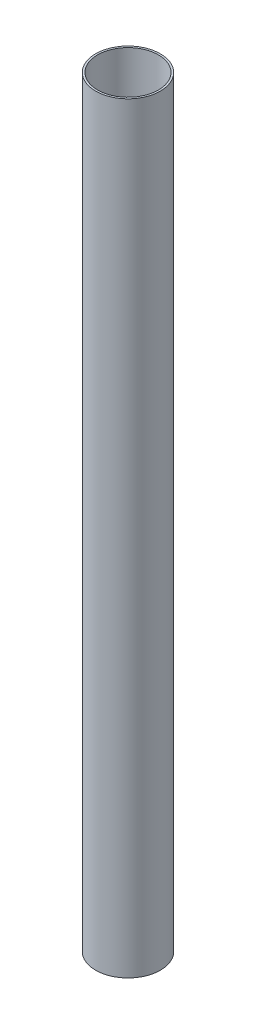
ISO-10303-21;
HEADER;
FILE_DESCRIPTION(('STEP AP214'),'2;1');
FILE_NAME('part.step','',(''),(''),'','','');
FILE_SCHEMA(('AUTOMOTIVE_DESIGN { 1 0 10303 214 1 1 1 1 }'));
ENDSEC;
DATA;
#1=APPLICATION_CONTEXT('core data for automotive mechanical design processes');
#2=APPLICATION_PROTOCOL_DEFINITION('international standard','automotive_design',2000,#1);
#3=PRODUCT_CONTEXT('',#1,'mechanical');
#4=PRODUCT('Part','Part','',(#3));
#5=PRODUCT_RELATED_PRODUCT_CATEGORY('part','',(#4));
#6=PRODUCT_DEFINITION_FORMATION('','',#4);
#7=PRODUCT_DEFINITION_CONTEXT('part definition',#1,'design');
#8=PRODUCT_DEFINITION('design','',#6,#7);
#9=PRODUCT_DEFINITION_SHAPE('','',#8);
#10=(LENGTH_UNIT() NAMED_UNIT(*) SI_UNIT(.MILLI.,.METRE.));
#11=(NAMED_UNIT(*) PLANE_ANGLE_UNIT() SI_UNIT($,.RADIAN.));
#12=(NAMED_UNIT(*) SI_UNIT($,.STERADIAN.) SOLID_ANGLE_UNIT());
#13=UNCERTAINTY_MEASURE_WITH_UNIT(LENGTH_MEASURE(1.E-05),#10,'distance_accuracy_value','');
#14=(GEOMETRIC_REPRESENTATION_CONTEXT(3) GLOBAL_UNCERTAINTY_ASSIGNED_CONTEXT((#13)) GLOBAL_UNIT_ASSIGNED_CONTEXT((#10,
#11,#12)) REPRESENTATION_CONTEXT('',''));
#15=CARTESIAN_POINT('',(0.,0.,0.));
#16=DIRECTION('',(0.,0.,1.));
#17=DIRECTION('',(1.,0.,0.));
#18=AXIS2_PLACEMENT_3D('',#15,#16,#17);
#19=CARTESIAN_POINT('',(0.,200.,0.));
#20=DIRECTION('',(0.,1.,0.));
#21=DIRECTION('',(0.,0.,1.));
#22=AXIS2_PLACEMENT_3D('',#19,#20,#21);
#23=PLANE('',#22);
#24=CARTESIAN_POINT('',(0.,200.,0.));
#25=DIRECTION('',(0.,1.,0.));
#26=DIRECTION('',(0.,0.,1.));
#27=AXIS2_PLACEMENT_3D('',#24,#25,#26);
#28=CIRCLE('',#27,8.5);
#29=CARTESIAN_POINT('',(0.,200.,8.5));
#30=VERTEX_POINT('',#29);
#31=EDGE_CURVE('E10',#30,#30,#28,.T.);
#32=ORIENTED_EDGE('',*,*,#31,.T.);
#33=EDGE_LOOP('',(#32));
#34=FACE_BOUND('',#33,.T.);
#35=CARTESIAN_POINT('',(0.,200.,0.));
#36=DIRECTION('',(0.,1.,0.));
#37=DIRECTION('',(0.,0.,1.));
#38=AXIS2_PLACEMENT_3D('',#35,#36,#37);
#39=CIRCLE('',#38,8.);
#40=CARTESIAN_POINT('',(0.,200.,8.));
#41=VERTEX_POINT('',#40);
#42=EDGE_CURVE('E54',#41,#41,#39,.T.);
#43=ORIENTED_EDGE('',*,*,#42,.F.);
#44=EDGE_LOOP('',(#43));
#45=FACE_BOUND('',#44,.T.);
#46=ADVANCED_FACE('F41',(#34,#45),#23,.T.);
#47=CARTESIAN_POINT('',(0.,0.,0.));
#48=DIRECTION('',(0.,1.,0.));
#49=DIRECTION('',(0.,0.,1.));
#50=AXIS2_PLACEMENT_3D('',#47,#48,#49);
#51=PLANE('',#50);
#52=CARTESIAN_POINT('',(0.,0.,0.));
#53=DIRECTION('',(0.,1.,0.));
#54=DIRECTION('',(0.,0.,1.));
#55=AXIS2_PLACEMENT_3D('',#52,#53,#54);
#56=CIRCLE('',#55,8.5);
#57=CARTESIAN_POINT('',(0.,0.,8.5));
#58=VERTEX_POINT('',#57);
#59=EDGE_CURVE('E45',#58,#58,#56,.T.);
#60=ORIENTED_EDGE('',*,*,#59,.F.);
#61=EDGE_LOOP('',(#60));
#62=FACE_BOUND('',#61,.T.);
#63=CARTESIAN_POINT('',(0.,0.,0.));
#64=DIRECTION('',(0.,1.,0.));
#65=DIRECTION('',(0.,0.,1.));
#66=AXIS2_PLACEMENT_3D('',#63,#64,#65);
#67=CIRCLE('',#66,8.);
#68=CARTESIAN_POINT('',(0.,0.,8.));
#69=VERTEX_POINT('',#68);
#70=EDGE_CURVE('E56',#69,#69,#67,.T.);
#71=ORIENTED_EDGE('',*,*,#70,.T.);
#72=EDGE_LOOP('',(#71));
#73=FACE_BOUND('',#72,.T.);
#74=ADVANCED_FACE('F68',(#62,#73),#51,.F.);
#75=CARTESIAN_POINT('',(0.,200.,0.));
#76=DIRECTION('',(0.,-1.,0.));
#77=DIRECTION('',(0.,0.,-1.));
#78=AXIS2_PLACEMENT_3D('',#75,#76,#77);
#79=CYLINDRICAL_SURFACE('',#78,8.5);
#80=ORIENTED_EDGE('',*,*,#31,.F.);
#81=EDGE_LOOP('',(#80));
#82=FACE_BOUND('',#81,.T.);
#83=ORIENTED_EDGE('',*,*,#59,.T.);
#84=EDGE_LOOP('',(#83));
#85=FACE_BOUND('',#84,.T.);
#86=ADVANCED_FACE('F43',(#82,#85),#79,.T.);
#87=CARTESIAN_POINT('',(0.,200.,0.));
#88=DIRECTION('',(0.,-1.,0.));
#89=DIRECTION('',(0.,0.,-1.));
#90=AXIS2_PLACEMENT_3D('',#87,#88,#89);
#91=CYLINDRICAL_SURFACE('',#90,8.);
#92=ORIENTED_EDGE('',*,*,#42,.T.);
#93=EDGE_LOOP('',(#92));
#94=FACE_BOUND('',#93,.T.);
#95=ORIENTED_EDGE('',*,*,#70,.F.);
#96=EDGE_LOOP('',(#95));
#97=FACE_BOUND('',#96,.T.);
#98=ADVANCED_FACE('F64',(#94,#97),#91,.F.);
#99=CLOSED_SHELL('',(#46,#74,#86,#98));
#100=MANIFOLD_SOLID_BREP('B2',#99);
#101=ADVANCED_BREP_SHAPE_REPRESENTATION('',(#18,#100),#14);
#102=SHAPE_DEFINITION_REPRESENTATION(#9,#101);
ENDSEC;
END-ISO-10303-21;
